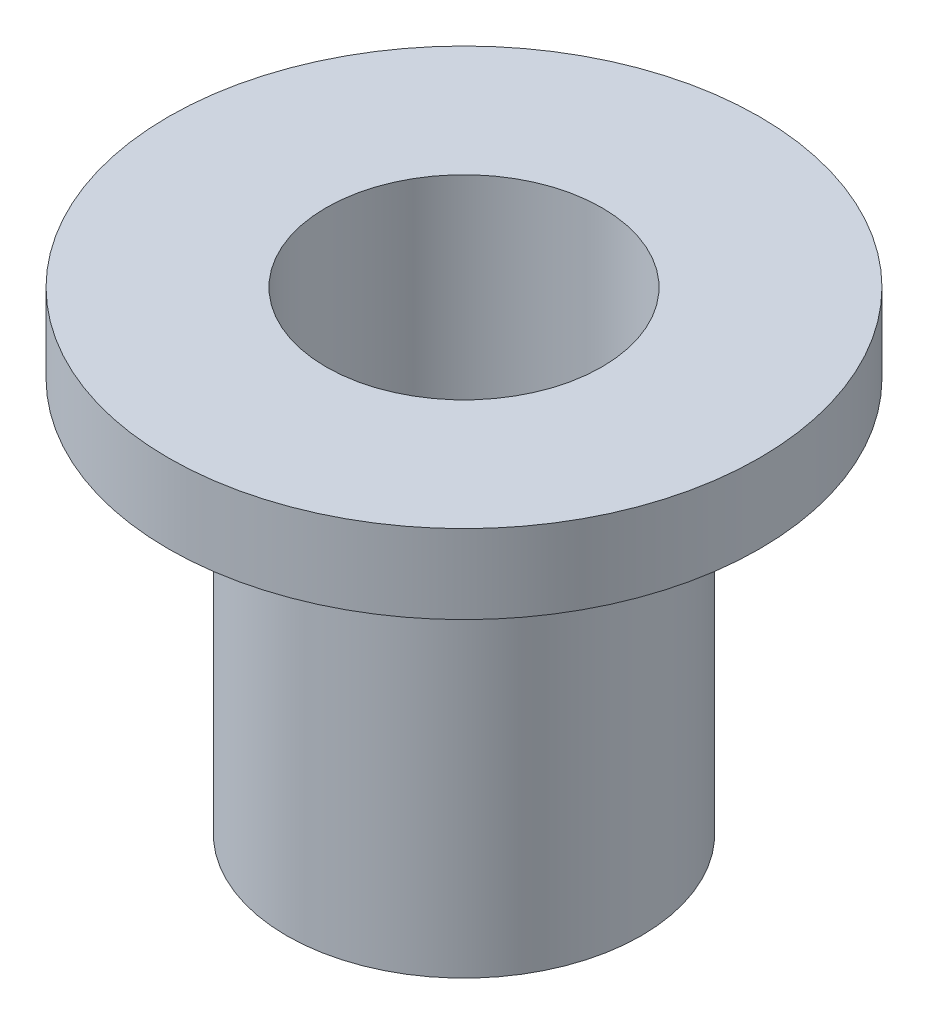
ISO-10303-21;
HEADER;
FILE_DESCRIPTION(('STEP AP214'),'2;1');
FILE_NAME('part.step','',(''),(''),'','','');
FILE_SCHEMA(('AUTOMOTIVE_DESIGN { 1 0 10303 214 1 1 1 1 }'));
ENDSEC;
DATA;
#1=APPLICATION_CONTEXT('core data for automotive mechanical design processes');
#2=APPLICATION_PROTOCOL_DEFINITION('international standard','automotive_design',2000,#1);
#3=PRODUCT_CONTEXT('',#1,'mechanical');
#4=PRODUCT('Part','Part','',(#3));
#5=PRODUCT_RELATED_PRODUCT_CATEGORY('part','',(#4));
#6=PRODUCT_DEFINITION_FORMATION('','',#4);
#7=PRODUCT_DEFINITION_CONTEXT('part definition',#1,'design');
#8=PRODUCT_DEFINITION('design','',#6,#7);
#9=PRODUCT_DEFINITION_SHAPE('','',#8);
#10=(LENGTH_UNIT() NAMED_UNIT(*) SI_UNIT(.MILLI.,.METRE.));
#11=(NAMED_UNIT(*) PLANE_ANGLE_UNIT() SI_UNIT($,.RADIAN.));
#12=(NAMED_UNIT(*) SI_UNIT($,.STERADIAN.) SOLID_ANGLE_UNIT());
#13=UNCERTAINTY_MEASURE_WITH_UNIT(LENGTH_MEASURE(1.E-05),#10,'distance_accuracy_value','');
#14=(GEOMETRIC_REPRESENTATION_CONTEXT(3) GLOBAL_UNCERTAINTY_ASSIGNED_CONTEXT((#13)) GLOBAL_UNIT_ASSIGNED_CONTEXT((#10,
#11,#12)) REPRESENTATION_CONTEXT('',''));
#15=CARTESIAN_POINT('',(0.,0.,0.));
#16=DIRECTION('',(0.,0.,1.));
#17=DIRECTION('',(1.,0.,0.));
#18=AXIS2_PLACEMENT_3D('',#15,#16,#17);
#19=CARTESIAN_POINT('',(0.,0.,0.));
#20=DIRECTION('',(0.,1.,0.));
#21=DIRECTION('',(0.,0.,1.));
#22=AXIS2_PLACEMENT_3D('',#19,#20,#21);
#23=PLANE('',#22);
#24=CARTESIAN_POINT('',(0.,0.,0.));
#25=DIRECTION('',(0.,1.,0.));
#26=DIRECTION('',(0.,0.,1.));
#27=AXIS2_PLACEMENT_3D('',#24,#25,#26);
#28=CIRCLE('',#27,4.5);
#29=CARTESIAN_POINT('',(0.,0.,4.5));
#30=VERTEX_POINT('',#29);
#31=EDGE_CURVE('E34',#30,#30,#28,.T.);
#32=ORIENTED_EDGE('',*,*,#31,.F.);
#33=EDGE_LOOP('',(#32));
#34=FACE_BOUND('',#33,.T.);
#35=CARTESIAN_POINT('',(0.,0.,0.));
#36=DIRECTION('',(0.,1.,0.));
#37=DIRECTION('',(0.,0.,1.));
#38=AXIS2_PLACEMENT_3D('',#35,#36,#37);
#39=CIRCLE('',#38,3.5);
#40=CARTESIAN_POINT('',(0.,0.,3.5));
#41=VERTEX_POINT('',#40);
#42=EDGE_CURVE('E41',#41,#41,#39,.T.);
#43=ORIENTED_EDGE('',*,*,#42,.T.);
#44=EDGE_LOOP('',(#43));
#45=FACE_BOUND('',#44,.T.);
#46=ADVANCED_FACE('F30',(#34,#45),#23,.F.);
#47=CARTESIAN_POINT('',(0.,10.,0.));
#48=DIRECTION('',(0.,-1.,0.));
#49=DIRECTION('',(0.,0.,-1.));
#50=AXIS2_PLACEMENT_3D('',#47,#48,#49);
#51=CYLINDRICAL_SURFACE('',#50,4.5);
#52=CARTESIAN_POINT('',(0.,10.,0.));
#53=DIRECTION('',(0.,1.,0.));
#54=DIRECTION('',(0.,0.,1.));
#55=AXIS2_PLACEMENT_3D('',#52,#53,#54);
#56=CIRCLE('',#55,4.5);
#57=CARTESIAN_POINT('',(0.,10.,4.5));
#58=VERTEX_POINT('',#57);
#59=EDGE_CURVE('E10',#58,#58,#56,.T.);
#60=ORIENTED_EDGE('',*,*,#59,.F.);
#61=EDGE_LOOP('',(#60));
#62=FACE_BOUND('',#61,.T.);
#63=ORIENTED_EDGE('',*,*,#31,.T.);
#64=EDGE_LOOP('',(#63));
#65=FACE_BOUND('',#64,.T.);
#66=ADVANCED_FACE('F32',(#62,#65),#51,.T.);
#67=CARTESIAN_POINT('',(0.,10.,0.));
#68=DIRECTION('',(0.,-1.,0.));
#69=DIRECTION('',(0.,0.,-1.));
#70=AXIS2_PLACEMENT_3D('',#67,#68,#69);
#71=CYLINDRICAL_SURFACE('',#70,3.5);
#72=ORIENTED_EDGE('',*,*,#42,.F.);
#73=EDGE_LOOP('',(#72));
#74=FACE_BOUND('',#73,.T.);
#75=CARTESIAN_POINT('',(0.,12.,0.));
#76=DIRECTION('',(0.,1.,0.));
#77=DIRECTION('',(0.,0.,1.));
#78=AXIS2_PLACEMENT_3D('',#75,#76,#77);
#79=CIRCLE('',#78,3.5);
#80=CARTESIAN_POINT('',(0.,12.,3.5));
#81=VERTEX_POINT('',#80);
#82=EDGE_CURVE('E49',#81,#81,#79,.T.);
#83=ORIENTED_EDGE('',*,*,#82,.T.);
#84=EDGE_LOOP('',(#83));
#85=FACE_BOUND('',#84,.T.);
#86=ADVANCED_FACE('F55',(#74,#85),#71,.F.);
#87=CARTESIAN_POINT('',(0.,12.,0.));
#88=DIRECTION('',(0.,1.,0.));
#89=DIRECTION('',(0.,0.,1.));
#90=AXIS2_PLACEMENT_3D('',#87,#88,#89);
#91=PLANE('',#90);
#92=CARTESIAN_POINT('',(0.,12.,0.));
#93=DIRECTION('',(0.,1.,0.));
#94=DIRECTION('',(0.,0.,1.));
#95=AXIS2_PLACEMENT_3D('',#92,#93,#94);
#96=CIRCLE('',#95,7.5);
#97=CARTESIAN_POINT('',(0.,12.,7.5));
#98=VERTEX_POINT('',#97);
#99=EDGE_CURVE('E45',#98,#98,#96,.T.);
#100=ORIENTED_EDGE('',*,*,#99,.T.);
#101=EDGE_LOOP('',(#100));
#102=FACE_BOUND('',#101,.T.);
#103=ORIENTED_EDGE('',*,*,#82,.F.);
#104=EDGE_LOOP('',(#103));
#105=FACE_BOUND('',#104,.T.);
#106=ADVANCED_FACE('F57',(#102,#105),#91,.T.);
#107=CARTESIAN_POINT('',(0.,10.,0.));
#108=DIRECTION('',(0.,1.,0.));
#109=DIRECTION('',(0.,0.,1.));
#110=AXIS2_PLACEMENT_3D('',#107,#108,#109);
#111=PLANE('',#110);
#112=ORIENTED_EDGE('',*,*,#59,.T.);
#113=EDGE_LOOP('',(#112));
#114=FACE_BOUND('',#113,.T.);
#115=CARTESIAN_POINT('',(0.,10.,0.));
#116=DIRECTION('',(0.,1.,0.));
#117=DIRECTION('',(0.,0.,1.));
#118=AXIS2_PLACEMENT_3D('',#115,#116,#117);
#119=CIRCLE('',#118,7.5);
#120=CARTESIAN_POINT('',(0.,10.,7.5));
#121=VERTEX_POINT('',#120);
#122=EDGE_CURVE('E46',#121,#121,#119,.T.);
#123=ORIENTED_EDGE('',*,*,#122,.F.);
#124=EDGE_LOOP('',(#123));
#125=FACE_BOUND('',#124,.T.);
#126=ADVANCED_FACE('F59',(#114,#125),#111,.F.);
#127=CARTESIAN_POINT('',(0.,12.,0.));
#128=DIRECTION('',(0.,-1.,0.));
#129=DIRECTION('',(0.,0.,-1.));
#130=AXIS2_PLACEMENT_3D('',#127,#128,#129);
#131=CYLINDRICAL_SURFACE('',#130,7.5);
#132=ORIENTED_EDGE('',*,*,#99,.F.);
#133=EDGE_LOOP('',(#132));
#134=FACE_BOUND('',#133,.T.);
#135=ORIENTED_EDGE('',*,*,#122,.T.);
#136=EDGE_LOOP('',(#135));
#137=FACE_BOUND('',#136,.T.);
#138=ADVANCED_FACE('F66',(#134,#137),#131,.T.);
#139=CLOSED_SHELL('',(#46,#66,#86,#106,#126,#138));
#140=MANIFOLD_SOLID_BREP('B2',#139);
#141=ADVANCED_BREP_SHAPE_REPRESENTATION('',(#18,#140),#14);
#142=SHAPE_DEFINITION_REPRESENTATION(#9,#141);
ENDSEC;
END-ISO-10303-21;
